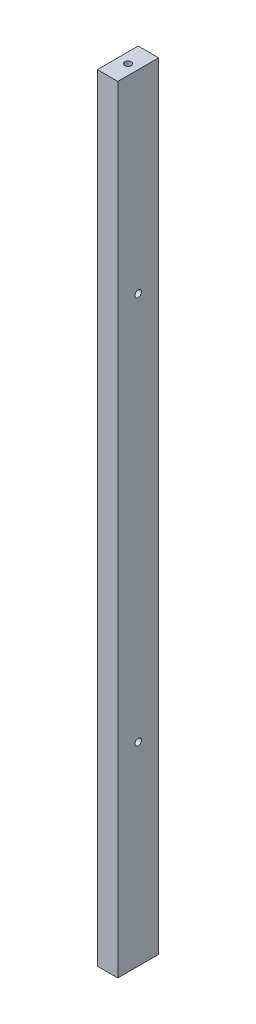
ISO-10303-21;
HEADER;
FILE_DESCRIPTION(('STEP AP214'),'2;1');
FILE_NAME('part.step','',(''),(''),'','','');
FILE_SCHEMA(('AUTOMOTIVE_DESIGN { 1 0 10303 214 1 1 1 1 }'));
ENDSEC;
DATA;
#1=APPLICATION_CONTEXT('core data for automotive mechanical design processes');
#2=APPLICATION_PROTOCOL_DEFINITION('international standard','automotive_design',2000,#1);
#3=PRODUCT_CONTEXT('',#1,'mechanical');
#4=PRODUCT('Part','Part','',(#3));
#5=PRODUCT_RELATED_PRODUCT_CATEGORY('part','',(#4));
#6=PRODUCT_DEFINITION_FORMATION('','',#4);
#7=PRODUCT_DEFINITION_CONTEXT('part definition',#1,'design');
#8=PRODUCT_DEFINITION('design','',#6,#7);
#9=PRODUCT_DEFINITION_SHAPE('','',#8);
#10=(LENGTH_UNIT() NAMED_UNIT(*) SI_UNIT(.MILLI.,.METRE.));
#11=(NAMED_UNIT(*) PLANE_ANGLE_UNIT() SI_UNIT($,.RADIAN.));
#12=(NAMED_UNIT(*) SI_UNIT($,.STERADIAN.) SOLID_ANGLE_UNIT());
#13=UNCERTAINTY_MEASURE_WITH_UNIT(LENGTH_MEASURE(1.E-05),#10,'distance_accuracy_value','');
#14=(GEOMETRIC_REPRESENTATION_CONTEXT(3) GLOBAL_UNCERTAINTY_ASSIGNED_CONTEXT((#13)) GLOBAL_UNIT_ASSIGNED_CONTEXT((#10,
#11,#12)) REPRESENTATION_CONTEXT('',''));
#15=CARTESIAN_POINT('',(0.,0.,0.));
#16=DIRECTION('',(0.,0.,1.));
#17=DIRECTION('',(1.,0.,0.));
#18=AXIS2_PLACEMENT_3D('',#15,#16,#17);
#19=CARTESIAN_POINT('',(-12.5,950.,-25.));
#20=DIRECTION('',(1.,0.,0.));
#21=DIRECTION('',(0.,0.,-1.));
#22=AXIS2_PLACEMENT_3D('',#19,#20,#21);
#23=PLANE('',#22);
#24=CARTESIAN_POINT('',(-12.5,712.5,0.));
#25=DIRECTION('',(1.,0.,0.));
#26=DIRECTION('',(0.,0.,-1.));
#27=AXIS2_PLACEMENT_3D('',#24,#25,#26);
#28=CIRCLE('',#27,4.);
#29=CARTESIAN_POINT('',(-12.5000000000001,712.5,-4.));
#30=VERTEX_POINT('',#29);
#31=EDGE_CURVE('E114',#30,#30,#28,.T.);
#32=ORIENTED_EDGE('',*,*,#31,.T.);
#33=EDGE_LOOP('',(#32));
#34=FACE_BOUND('',#33,.T.);
#35=CARTESIAN_POINT('',(-12.5,237.5,0.));
#36=DIRECTION('',(1.,0.,0.));
#37=DIRECTION('',(0.,0.,-1.));
#38=AXIS2_PLACEMENT_3D('',#35,#36,#37);
#39=CIRCLE('',#38,4.);
#40=CARTESIAN_POINT('',(-12.5000000000001,237.5,-4.));
#41=VERTEX_POINT('',#40);
#42=EDGE_CURVE('E134',#41,#41,#39,.T.);
#43=ORIENTED_EDGE('',*,*,#42,.T.);
#44=EDGE_LOOP('',(#43));
#45=FACE_BOUND('',#44,.T.);
#46=DIRECTION('',(0.,0.,1.));
#47=VECTOR('',#46,1.);
#48=CARTESIAN_POINT('',(-12.5,0.,-25.));
#49=LINE('',#48,#47);
#50=CARTESIAN_POINT('',(-12.5,0.,-25.));
#51=VERTEX_POINT('',#50);
#52=CARTESIAN_POINT('',(-12.5,0.,25.));
#53=VERTEX_POINT('',#52);
#54=EDGE_CURVE('E110',#51,#53,#49,.T.);
#55=ORIENTED_EDGE('',*,*,#54,.T.);
#56=DIRECTION('',(0.,-1.,0.));
#57=VECTOR('',#56,1.);
#58=CARTESIAN_POINT('',(-12.5,950.,25.));
#59=LINE('',#58,#57);
#60=CARTESIAN_POINT('',(-12.5,950.,25.));
#61=VERTEX_POINT('',#60);
#62=EDGE_CURVE('E11',#61,#53,#59,.T.);
#63=ORIENTED_EDGE('',*,*,#62,.F.);
#64=DIRECTION('',(0.,0.,1.));
#65=VECTOR('',#64,1.);
#66=CARTESIAN_POINT('',(-12.5,950.,-25.));
#67=LINE('',#66,#65);
#68=CARTESIAN_POINT('',(-12.5,950.,-25.));
#69=VERTEX_POINT('',#68);
#70=EDGE_CURVE('E94',#69,#61,#67,.T.);
#71=ORIENTED_EDGE('',*,*,#70,.F.);
#72=DIRECTION('',(0.,-1.,0.));
#73=VECTOR('',#72,1.);
#74=CARTESIAN_POINT('',(-12.5,950.,-25.));
#75=LINE('',#74,#73);
#76=EDGE_CURVE('E106',#69,#51,#75,.T.);
#77=ORIENTED_EDGE('',*,*,#76,.T.);
#78=EDGE_LOOP('',(#55,#63,#71,#77));
#79=FACE_BOUND('',#78,.T.);
#80=ADVANCED_FACE('F42',(#34,#45,#79),#23,.F.);
#81=CARTESIAN_POINT('',(12.5,950.,25.));
#82=DIRECTION('',(0.,0.,-1.));
#83=DIRECTION('',(-1.,0.,0.));
#84=AXIS2_PLACEMENT_3D('',#81,#82,#83);
#85=PLANE('',#84);
#86=DIRECTION('',(1.,0.,0.));
#87=VECTOR('',#86,1.);
#88=CARTESIAN_POINT('',(12.5,0.,25.));
#89=LINE('',#88,#87);
#90=CARTESIAN_POINT('',(12.5,0.,25.));
#91=VERTEX_POINT('',#90);
#92=EDGE_CURVE('E99',#53,#91,#89,.T.);
#93=ORIENTED_EDGE('',*,*,#92,.T.);
#94=DIRECTION('',(0.,-1.,0.));
#95=VECTOR('',#94,1.);
#96=CARTESIAN_POINT('',(12.5,950.,25.));
#97=LINE('',#96,#95);
#98=CARTESIAN_POINT('',(12.5,950.,25.));
#99=VERTEX_POINT('',#98);
#100=EDGE_CURVE('E51',#99,#91,#97,.T.);
#101=ORIENTED_EDGE('',*,*,#100,.F.);
#102=DIRECTION('',(1.,0.,0.));
#103=VECTOR('',#102,1.);
#104=CARTESIAN_POINT('',(12.5,950.,25.));
#105=LINE('',#104,#103);
#106=EDGE_CURVE('E89',#61,#99,#105,.T.);
#107=ORIENTED_EDGE('',*,*,#106,.F.);
#108=ORIENTED_EDGE('',*,*,#62,.T.);
#109=EDGE_LOOP('',(#93,#101,#107,#108));
#110=FACE_BOUND('',#109,.T.);
#111=ADVANCED_FACE('F98',(#110),#85,.F.);
#112=CARTESIAN_POINT('',(12.5,950.,-25.));
#113=DIRECTION('',(-1.,0.,0.));
#114=DIRECTION('',(0.,0.,1.));
#115=AXIS2_PLACEMENT_3D('',#112,#113,#114);
#116=PLANE('',#115);
#117=CARTESIAN_POINT('',(12.5,712.5,0.));
#118=DIRECTION('',(1.,0.,0.));
#119=DIRECTION('',(0.,0.,-1.));
#120=AXIS2_PLACEMENT_3D('',#117,#118,#119);
#121=CIRCLE('',#120,4.);
#122=CARTESIAN_POINT('',(12.5000000000001,712.5,-4.));
#123=VERTEX_POINT('',#122);
#124=EDGE_CURVE('E138',#123,#123,#121,.T.);
#125=ORIENTED_EDGE('',*,*,#124,.F.);
#126=EDGE_LOOP('',(#125));
#127=FACE_BOUND('',#126,.T.);
#128=CARTESIAN_POINT('',(12.5,237.5,0.));
#129=DIRECTION('',(1.,0.,0.));
#130=DIRECTION('',(0.,0.,-1.));
#131=AXIS2_PLACEMENT_3D('',#128,#129,#130);
#132=CIRCLE('',#131,4.);
#133=CARTESIAN_POINT('',(12.5000000000001,237.5,-4.));
#134=VERTEX_POINT('',#133);
#135=EDGE_CURVE('E139',#134,#134,#132,.T.);
#136=ORIENTED_EDGE('',*,*,#135,.F.);
#137=EDGE_LOOP('',(#136));
#138=FACE_BOUND('',#137,.T.);
#139=DIRECTION('',(0.,0.,-1.));
#140=VECTOR('',#139,1.);
#141=CARTESIAN_POINT('',(12.5,0.,-25.));
#142=LINE('',#141,#140);
#143=CARTESIAN_POINT('',(12.5,0.,-25.));
#144=VERTEX_POINT('',#143);
#145=EDGE_CURVE('E76',#91,#144,#142,.T.);
#146=ORIENTED_EDGE('',*,*,#145,.T.);
#147=DIRECTION('',(0.,-1.,0.));
#148=VECTOR('',#147,1.);
#149=CARTESIAN_POINT('',(12.5,950.,-25.));
#150=LINE('',#149,#148);
#151=CARTESIAN_POINT('',(12.5,950.,-25.));
#152=VERTEX_POINT('',#151);
#153=EDGE_CURVE('E101',#152,#144,#150,.T.);
#154=ORIENTED_EDGE('',*,*,#153,.F.);
#155=DIRECTION('',(0.,0.,-1.));
#156=VECTOR('',#155,1.);
#157=CARTESIAN_POINT('',(12.5,950.,-25.));
#158=LINE('',#157,#156);
#159=EDGE_CURVE('E92',#99,#152,#158,.T.);
#160=ORIENTED_EDGE('',*,*,#159,.F.);
#161=ORIENTED_EDGE('',*,*,#100,.T.);
#162=EDGE_LOOP('',(#146,#154,#160,#161));
#163=FACE_BOUND('',#162,.T.);
#164=ADVANCED_FACE('F102',(#127,#138,#163),#116,.F.);
#165=CARTESIAN_POINT('',(12.5,950.,-25.));
#166=DIRECTION('',(0.,0.,1.));
#167=DIRECTION('',(1.,0.,0.));
#168=AXIS2_PLACEMENT_3D('',#165,#166,#167);
#169=PLANE('',#168);
#170=DIRECTION('',(-1.,0.,0.));
#171=VECTOR('',#170,1.);
#172=CARTESIAN_POINT('',(12.5,0.,-25.));
#173=LINE('',#172,#171);
#174=EDGE_CURVE('E82',#144,#51,#173,.T.);
#175=ORIENTED_EDGE('',*,*,#174,.T.);
#176=ORIENTED_EDGE('',*,*,#76,.F.);
#177=DIRECTION('',(-1.,0.,0.));
#178=VECTOR('',#177,1.);
#179=CARTESIAN_POINT('',(12.5,950.,-25.));
#180=LINE('',#179,#178);
#181=EDGE_CURVE('E59',#152,#69,#180,.T.);
#182=ORIENTED_EDGE('',*,*,#181,.F.);
#183=ORIENTED_EDGE('',*,*,#153,.T.);
#184=EDGE_LOOP('',(#175,#176,#182,#183));
#185=FACE_BOUND('',#184,.T.);
#186=ADVANCED_FACE('F124',(#185),#169,.F.);
#187=CARTESIAN_POINT('',(0.,950.,0.));
#188=DIRECTION('',(0.,-1.,0.));
#189=DIRECTION('',(0.,0.,-1.));
#190=AXIS2_PLACEMENT_3D('',#187,#188,#189);
#191=PLANE('',#190);
#192=CARTESIAN_POINT('',(0.,950.,0.));
#193=DIRECTION('',(0.,1.,0.));
#194=DIRECTION('',(0.,0.,1.));
#195=AXIS2_PLACEMENT_3D('',#192,#193,#194);
#196=CIRCLE('',#195,4.);
#197=CARTESIAN_POINT('',(0.,950.,4.));
#198=VERTEX_POINT('',#197);
#199=EDGE_CURVE('E147',#198,#198,#196,.T.);
#200=ORIENTED_EDGE('',*,*,#199,.F.);
#201=EDGE_LOOP('',(#200));
#202=FACE_BOUND('',#201,.T.);
#203=ORIENTED_EDGE('',*,*,#70,.T.);
#204=ORIENTED_EDGE('',*,*,#106,.T.);
#205=ORIENTED_EDGE('',*,*,#159,.T.);
#206=ORIENTED_EDGE('',*,*,#181,.T.);
#207=EDGE_LOOP('',(#203,#204,#205,#206));
#208=FACE_BOUND('',#207,.T.);
#209=ADVANCED_FACE('F90',(#202,#208),#191,.F.);
#210=CARTESIAN_POINT('',(0.,0.,0.));
#211=DIRECTION('',(0.,-1.,0.));
#212=DIRECTION('',(0.,0.,-1.));
#213=AXIS2_PLACEMENT_3D('',#210,#211,#212);
#214=PLANE('',#213);
#215=CARTESIAN_POINT('',(0.,0.,0.));
#216=DIRECTION('',(0.,-1.,0.));
#217=DIRECTION('',(0.,0.,-1.));
#218=AXIS2_PLACEMENT_3D('',#215,#216,#217);
#219=CIRCLE('',#218,4.);
#220=CARTESIAN_POINT('',(0.,0.,-4.));
#221=VERTEX_POINT('',#220);
#222=EDGE_CURVE('E155',#221,#221,#219,.T.);
#223=ORIENTED_EDGE('',*,*,#222,.F.);
#224=EDGE_LOOP('',(#223));
#225=FACE_BOUND('',#224,.T.);
#226=ORIENTED_EDGE('',*,*,#54,.F.);
#227=ORIENTED_EDGE('',*,*,#174,.F.);
#228=ORIENTED_EDGE('',*,*,#145,.F.);
#229=ORIENTED_EDGE('',*,*,#92,.F.);
#230=EDGE_LOOP('',(#226,#227,#228,#229));
#231=FACE_BOUND('',#230,.T.);
#232=ADVANCED_FACE('F127',(#225,#231),#214,.T.);
#233=CARTESIAN_POINT('',(-937.5,237.5,0.));
#234=DIRECTION('',(1.,0.,0.));
#235=DIRECTION('',(0.,0.,-1.));
#236=AXIS2_PLACEMENT_3D('',#233,#234,#235);
#237=CYLINDRICAL_SURFACE('',#236,4.);
#238=CARTESIAN_POINT('',(12.5000000000001,237.5,-4.));
#239=CARTESIAN_POINT('',(12.2395833333334,237.5,-4.));
#240=CARTESIAN_POINT('',(11.9791666666668,237.5,-4.));
#241=CARTESIAN_POINT('',(11.4583333333334,237.5,-4.));
#242=CARTESIAN_POINT('',(11.1979166666667,237.5,-4.));
#243=CARTESIAN_POINT('',(10.6770833333334,237.5,-4.));
#244=CARTESIAN_POINT('',(10.4166666666667,237.5,-4.));
#245=CARTESIAN_POINT('',(9.8958333333334,237.5,-4.));
#246=CARTESIAN_POINT('',(9.63541666666671,237.5,-4.));
#247=CARTESIAN_POINT('',(9.11458333333337,237.5,-4.));
#248=CARTESIAN_POINT('',(8.85416666666672,237.5,-4.));
#249=CARTESIAN_POINT('',(8.33333333333338,237.5,-4.));
#250=CARTESIAN_POINT('',(8.07291666666669,237.5,-4.));
#251=CARTESIAN_POINT('',(7.55208333333335,237.5,-4.));
#252=CARTESIAN_POINT('',(7.2916666666667,237.5,-4.));
#253=CARTESIAN_POINT('',(6.77083333333336,237.5,-4.));
#254=CARTESIAN_POINT('',(6.51041666666667,237.5,-4.));
#255=CARTESIAN_POINT('',(5.98958333333333,237.5,-4.));
#256=CARTESIAN_POINT('',(5.72916666666667,237.5,-4.));
#257=CARTESIAN_POINT('',(5.20833333333337,237.5,-4.));
#258=CARTESIAN_POINT('',(4.94791666666672,237.5,-4.));
#259=CARTESIAN_POINT('',(4.42708333333338,237.5,-4.));
#260=CARTESIAN_POINT('',(4.16666666666669,237.5,-4.));
#261=CARTESIAN_POINT('',(3.64583333333335,237.5,-4.));
#262=CARTESIAN_POINT('',(3.3854166666667,237.5,-4.));
#263=CARTESIAN_POINT('',(2.86458333333336,237.5,-4.));
#264=CARTESIAN_POINT('',(2.60416666666667,237.5,-4.));
#265=CARTESIAN_POINT('',(2.08333333333333,237.5,-4.));
#266=CARTESIAN_POINT('',(1.82291666666667,237.5,-4.));
#267=CARTESIAN_POINT('',(1.30208333333333,237.5,-4.));
#268=CARTESIAN_POINT('',(1.04166666666664,237.5,-4.));
#269=CARTESIAN_POINT('',(0.520833333333304,237.5,-4.));
#270=CARTESIAN_POINT('',(0.260416666666652,237.5,-4.));
#271=CARTESIAN_POINT('',(-0.260416666666652,237.5,-4.));
#272=CARTESIAN_POINT('',(-0.520833333333304,237.5,-4.));
#273=CARTESIAN_POINT('',(-1.04166666666664,237.5,-4.));
#274=CARTESIAN_POINT('',(-1.30208333333333,237.5,-4.));
#275=CARTESIAN_POINT('',(-1.82291666666667,237.5,-4.));
#276=CARTESIAN_POINT('',(-2.08333333333333,237.5,-4.));
#277=CARTESIAN_POINT('',(-2.60416666666667,237.5,-4.));
#278=CARTESIAN_POINT('',(-2.86458333333336,237.5,-4.));
#279=CARTESIAN_POINT('',(-3.3854166666667,237.5,-4.));
#280=CARTESIAN_POINT('',(-3.64583333333335,237.5,-4.));
#281=CARTESIAN_POINT('',(-4.16666666666669,237.5,-4.));
#282=CARTESIAN_POINT('',(-4.42708333333338,237.5,-4.));
#283=CARTESIAN_POINT('',(-4.94791666666672,237.5,-4.));
#284=CARTESIAN_POINT('',(-5.20833333333337,237.5,-4.));
#285=CARTESIAN_POINT('',(-5.72916666666667,237.5,-4.));
#286=CARTESIAN_POINT('',(-5.98958333333333,237.5,-4.));
#287=CARTESIAN_POINT('',(-6.51041666666667,237.5,-4.));
#288=CARTESIAN_POINT('',(-6.77083333333336,237.5,-4.));
#289=CARTESIAN_POINT('',(-7.2916666666667,237.5,-4.));
#290=CARTESIAN_POINT('',(-7.55208333333335,237.5,-4.));
#291=CARTESIAN_POINT('',(-8.07291666666669,237.5,-4.));
#292=CARTESIAN_POINT('',(-8.33333333333338,237.5,-4.));
#293=CARTESIAN_POINT('',(-8.85416666666672,237.5,-4.));
#294=CARTESIAN_POINT('',(-9.11458333333337,237.5,-4.));
#295=CARTESIAN_POINT('',(-9.63541666666671,237.5,-4.));
#296=CARTESIAN_POINT('',(-9.8958333333334,237.5,-4.));
#297=CARTESIAN_POINT('',(-10.4166666666667,237.5,-4.));
#298=CARTESIAN_POINT('',(-10.6770833333334,237.5,-4.));
#299=CARTESIAN_POINT('',(-11.1979166666667,237.5,-4.));
#300=CARTESIAN_POINT('',(-11.4583333333334,237.5,-4.));
#301=CARTESIAN_POINT('',(-11.9791666666668,237.5,-4.));
#302=CARTESIAN_POINT('',(-12.2395833333334,237.5,-4.));
#303=CARTESIAN_POINT('',(-12.5000000000001,237.5,-4.));
#304=B_SPLINE_CURVE_WITH_KNOTS('',3,(#238,#239,#240,#241,#242,#243,#244,#245,#246,#247,#248,
#249,#250,#251,#252,#253,#254,#255,#256,#257,#258,#259,#260,#261,#262,#263,#264,#265,#266,#267,
#268,#269,#270,#271,#272,#273,#274,#275,#276,#277,#278,#279,#280,#281,#282,#283,#284,#285,#286,
#287,#288,#289,#290,#291,#292,#293,#294,#295,#296,#297,#298,#299,#300,#301,#302,#303),
.UNSPECIFIED.,.F.,.F.,(4,2,2,2,2,2,2,2,2,2,2,2,2,2,2,2,2,2,2,2,2,2,2,2,2,2,2,2,2,2,2,2,4),(0.,
0.781249999999956,1.56250000000002,2.34374999999998,3.12500000000004,3.90625,4.68750000000007,
5.46875000000002,6.25000000000009,7.03125000000004,7.8125,8.59375000000007,9.37500000000002,
10.1562500000001,10.9375,11.7187500000001,12.5000000000001,13.28125,14.0625000000001,14.84375,
15.6250000000001,16.4062500000001,17.1875000000001,17.9687500000001,18.75,19.5312500000001,
20.3125000000001,21.0937500000001,21.8750000000001,22.6562500000002,23.4375000000001,
24.2187500000002,25.0000000000001),.UNSPECIFIED.);
#305=EDGE_CURVE('BSEAM173',#134,#41,#304,.T.);
#306=ORIENTED_EDGE('',*,*,#135,.T.);
#307=ORIENTED_EDGE('',*,*,#42,.F.);
#308=ORIENTED_EDGE('',*,*,#305,.T.);
#309=ORIENTED_EDGE('',*,*,#305,.F.);
#310=EDGE_LOOP('',(#306,#308,#307,#309));
#311=FACE_BOUND('',#310,.T.);
#312=ADVANCED_FACE('F173',(#311),#237,.F.);
#313=CARTESIAN_POINT('',(-937.5,712.5,0.));
#314=DIRECTION('',(1.,0.,0.));
#315=DIRECTION('',(0.,0.,-1.));
#316=AXIS2_PLACEMENT_3D('',#313,#314,#315);
#317=CYLINDRICAL_SURFACE('',#316,4.);
#318=CARTESIAN_POINT('',(12.5000000000001,712.5,-4.));
#319=CARTESIAN_POINT('',(12.2395833333334,712.5,-4.));
#320=CARTESIAN_POINT('',(11.9791666666668,712.5,-4.));
#321=CARTESIAN_POINT('',(11.4583333333334,712.5,-4.));
#322=CARTESIAN_POINT('',(11.1979166666667,712.5,-4.));
#323=CARTESIAN_POINT('',(10.6770833333334,712.5,-4.));
#324=CARTESIAN_POINT('',(10.4166666666667,712.5,-4.));
#325=CARTESIAN_POINT('',(9.8958333333334,712.5,-4.));
#326=CARTESIAN_POINT('',(9.63541666666671,712.5,-4.));
#327=CARTESIAN_POINT('',(9.11458333333337,712.5,-4.));
#328=CARTESIAN_POINT('',(8.85416666666672,712.5,-4.));
#329=CARTESIAN_POINT('',(8.33333333333338,712.5,-4.));
#330=CARTESIAN_POINT('',(8.07291666666669,712.5,-4.));
#331=CARTESIAN_POINT('',(7.55208333333335,712.5,-4.));
#332=CARTESIAN_POINT('',(7.2916666666667,712.5,-4.));
#333=CARTESIAN_POINT('',(6.77083333333336,712.5,-4.));
#334=CARTESIAN_POINT('',(6.51041666666667,712.5,-4.));
#335=CARTESIAN_POINT('',(5.98958333333333,712.5,-4.));
#336=CARTESIAN_POINT('',(5.72916666666667,712.5,-4.));
#337=CARTESIAN_POINT('',(5.20833333333337,712.5,-4.));
#338=CARTESIAN_POINT('',(4.94791666666672,712.5,-4.));
#339=CARTESIAN_POINT('',(4.42708333333338,712.5,-4.));
#340=CARTESIAN_POINT('',(4.16666666666669,712.5,-4.));
#341=CARTESIAN_POINT('',(3.64583333333335,712.5,-4.));
#342=CARTESIAN_POINT('',(3.3854166666667,712.5,-4.));
#343=CARTESIAN_POINT('',(2.86458333333336,712.5,-4.));
#344=CARTESIAN_POINT('',(2.60416666666667,712.5,-4.));
#345=CARTESIAN_POINT('',(2.08333333333333,712.5,-4.));
#346=CARTESIAN_POINT('',(1.82291666666667,712.5,-4.));
#347=CARTESIAN_POINT('',(1.30208333333333,712.5,-4.));
#348=CARTESIAN_POINT('',(1.04166666666664,712.5,-4.));
#349=CARTESIAN_POINT('',(0.520833333333304,712.5,-4.));
#350=CARTESIAN_POINT('',(0.260416666666652,712.5,-4.));
#351=CARTESIAN_POINT('',(-0.260416666666652,712.5,-4.));
#352=CARTESIAN_POINT('',(-0.520833333333304,712.5,-4.));
#353=CARTESIAN_POINT('',(-1.04166666666664,712.5,-4.));
#354=CARTESIAN_POINT('',(-1.30208333333333,712.5,-4.));
#355=CARTESIAN_POINT('',(-1.82291666666667,712.5,-4.));
#356=CARTESIAN_POINT('',(-2.08333333333333,712.5,-4.));
#357=CARTESIAN_POINT('',(-2.60416666666667,712.5,-4.));
#358=CARTESIAN_POINT('',(-2.86458333333336,712.5,-4.));
#359=CARTESIAN_POINT('',(-3.3854166666667,712.5,-4.));
#360=CARTESIAN_POINT('',(-3.64583333333335,712.5,-4.));
#361=CARTESIAN_POINT('',(-4.16666666666669,712.5,-4.));
#362=CARTESIAN_POINT('',(-4.42708333333338,712.5,-4.));
#363=CARTESIAN_POINT('',(-4.94791666666672,712.5,-4.));
#364=CARTESIAN_POINT('',(-5.20833333333337,712.5,-4.));
#365=CARTESIAN_POINT('',(-5.72916666666667,712.5,-4.));
#366=CARTESIAN_POINT('',(-5.98958333333333,712.5,-4.));
#367=CARTESIAN_POINT('',(-6.51041666666667,712.5,-4.));
#368=CARTESIAN_POINT('',(-6.77083333333336,712.5,-4.));
#369=CARTESIAN_POINT('',(-7.2916666666667,712.5,-4.));
#370=CARTESIAN_POINT('',(-7.55208333333335,712.5,-4.));
#371=CARTESIAN_POINT('',(-8.07291666666669,712.5,-4.));
#372=CARTESIAN_POINT('',(-8.33333333333338,712.5,-4.));
#373=CARTESIAN_POINT('',(-8.85416666666672,712.5,-4.));
#374=CARTESIAN_POINT('',(-9.11458333333337,712.5,-4.));
#375=CARTESIAN_POINT('',(-9.63541666666671,712.5,-4.));
#376=CARTESIAN_POINT('',(-9.8958333333334,712.5,-4.));
#377=CARTESIAN_POINT('',(-10.4166666666667,712.5,-4.));
#378=CARTESIAN_POINT('',(-10.6770833333334,712.5,-4.));
#379=CARTESIAN_POINT('',(-11.1979166666667,712.5,-4.));
#380=CARTESIAN_POINT('',(-11.4583333333334,712.5,-4.));
#381=CARTESIAN_POINT('',(-11.9791666666668,712.5,-4.));
#382=CARTESIAN_POINT('',(-12.2395833333334,712.5,-4.));
#383=CARTESIAN_POINT('',(-12.5000000000001,712.5,-4.));
#384=B_SPLINE_CURVE_WITH_KNOTS('',3,(#318,#319,#320,#321,#322,#323,#324,#325,#326,#327,#328,
#329,#330,#331,#332,#333,#334,#335,#336,#337,#338,#339,#340,#341,#342,#343,#344,#345,#346,#347,
#348,#349,#350,#351,#352,#353,#354,#355,#356,#357,#358,#359,#360,#361,#362,#363,#364,#365,#366,
#367,#368,#369,#370,#371,#372,#373,#374,#375,#376,#377,#378,#379,#380,#381,#382,#383),
.UNSPECIFIED.,.F.,.F.,(4,2,2,2,2,2,2,2,2,2,2,2,2,2,2,2,2,2,2,2,2,2,2,2,2,2,2,2,2,2,2,2,4),(0.,
0.781249999999956,1.56250000000002,2.34374999999998,3.12500000000004,3.90625,4.68750000000007,
5.46875000000002,6.25000000000009,7.03125000000004,7.8125,8.59375000000007,9.37500000000002,
10.1562500000001,10.9375,11.7187500000001,12.5000000000001,13.28125,14.0625000000001,14.84375,
15.6250000000001,16.4062500000001,17.1875000000001,17.9687500000001,18.75,19.5312500000001,
20.3125000000001,21.0937500000001,21.8750000000001,22.6562500000002,23.4375000000001,
24.2187500000002,25.0000000000001),.UNSPECIFIED.);
#385=EDGE_CURVE('BSEAM180',#123,#30,#384,.T.);
#386=ORIENTED_EDGE('',*,*,#124,.T.);
#387=ORIENTED_EDGE('',*,*,#31,.F.);
#388=ORIENTED_EDGE('',*,*,#385,.T.);
#389=ORIENTED_EDGE('',*,*,#385,.F.);
#390=EDGE_LOOP('',(#386,#388,#387,#389));
#391=FACE_BOUND('',#390,.T.);
#392=ADVANCED_FACE('F180',(#391),#317,.F.);
#393=CARTESIAN_POINT('',(0.,940.,0.));
#394=DIRECTION('',(0.,1.,0.));
#395=DIRECTION('',(0.,0.,1.));
#396=AXIS2_PLACEMENT_3D('',#393,#394,#395);
#397=CYLINDRICAL_SURFACE('',#396,4.);
#398=CARTESIAN_POINT('',(0.,940.,0.));
#399=DIRECTION('',(0.,1.,0.));
#400=DIRECTION('',(0.,0.,1.));
#401=AXIS2_PLACEMENT_3D('',#398,#399,#400);
#402=CIRCLE('',#401,4.);
#403=CARTESIAN_POINT('',(0.,940.,4.));
#404=VERTEX_POINT('',#403);
#405=EDGE_CURVE('E143',#404,#404,#402,.T.);
#406=ORIENTED_EDGE('',*,*,#405,.F.);
#407=EDGE_LOOP('',(#406));
#408=FACE_BOUND('',#407,.T.);
#409=ORIENTED_EDGE('',*,*,#199,.T.);
#410=EDGE_LOOP('',(#409));
#411=FACE_BOUND('',#410,.T.);
#412=ADVANCED_FACE('F198',(#408,#411),#397,.F.);
#413=CARTESIAN_POINT('',(0.,940.,0.));
#414=DIRECTION('',(0.,1.,0.));
#415=DIRECTION('',(0.,0.,1.));
#416=AXIS2_PLACEMENT_3D('',#413,#414,#415);
#417=PLANE('',#416);
#418=ORIENTED_EDGE('',*,*,#405,.T.);
#419=EDGE_LOOP('',(#418));
#420=FACE_BOUND('',#419,.T.);
#421=ADVANCED_FACE('F168',(#420),#417,.T.);
#422=CARTESIAN_POINT('',(0.,10.,0.));
#423=DIRECTION('',(0.,-1.,0.));
#424=DIRECTION('',(0.,0.,-1.));
#425=AXIS2_PLACEMENT_3D('',#422,#423,#424);
#426=CYLINDRICAL_SURFACE('',#425,4.);
#427=CARTESIAN_POINT('',(0.,10.,0.));
#428=DIRECTION('',(0.,-1.,0.));
#429=DIRECTION('',(0.,0.,-1.));
#430=AXIS2_PLACEMENT_3D('',#427,#428,#429);
#431=CIRCLE('',#430,4.);
#432=CARTESIAN_POINT('',(0.,10.,-4.));
#433=VERTEX_POINT('',#432);
#434=EDGE_CURVE('E151',#433,#433,#431,.T.);
#435=ORIENTED_EDGE('',*,*,#434,.F.);
#436=EDGE_LOOP('',(#435));
#437=FACE_BOUND('',#436,.T.);
#438=ORIENTED_EDGE('',*,*,#222,.T.);
#439=EDGE_LOOP('',(#438));
#440=FACE_BOUND('',#439,.T.);
#441=ADVANCED_FACE('F165',(#437,#440),#426,.F.);
#442=CARTESIAN_POINT('',(0.,10.,0.));
#443=DIRECTION('',(0.,-1.,0.));
#444=DIRECTION('',(0.,0.,-1.));
#445=AXIS2_PLACEMENT_3D('',#442,#443,#444);
#446=PLANE('',#445);
#447=ORIENTED_EDGE('',*,*,#434,.T.);
#448=EDGE_LOOP('',(#447));
#449=FACE_BOUND('',#448,.T.);
#450=ADVANCED_FACE('F163',(#449),#446,.T.);
#451=CLOSED_SHELL('',(#80,#111,#164,#186,#209,#232,#312,#392,#412,#421,#441,#450));
#452=MANIFOLD_SOLID_BREP('B2',#451);
#453=ADVANCED_BREP_SHAPE_REPRESENTATION('',(#18,#452),#14);
#454=SHAPE_DEFINITION_REPRESENTATION(#9,#453);
ENDSEC;
END-ISO-10303-21;
